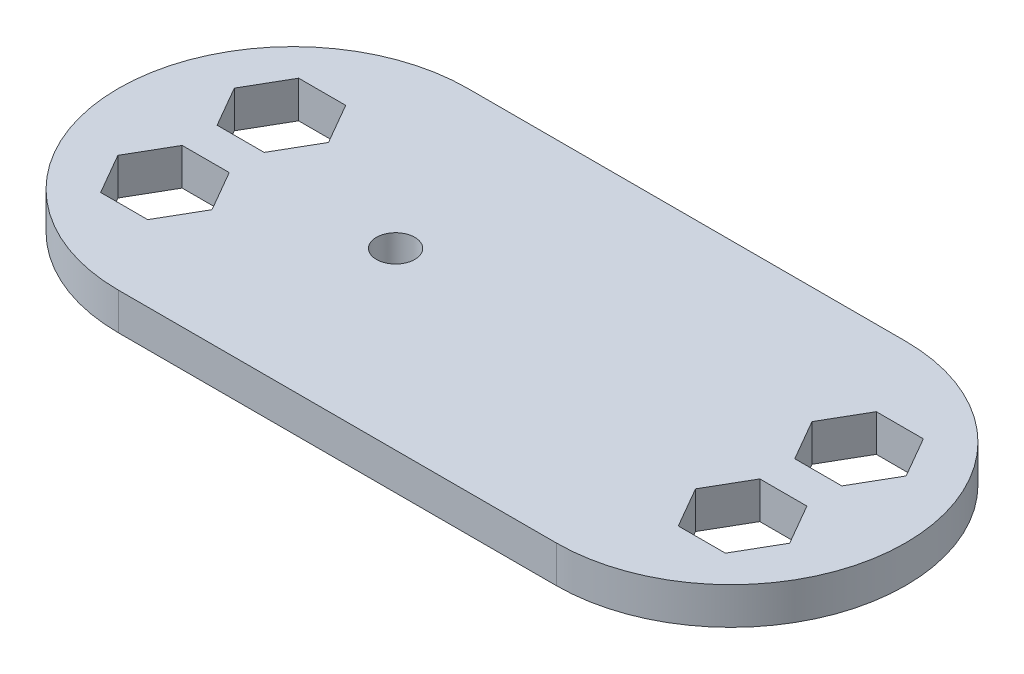
ISO-10303-21;
HEADER;
FILE_DESCRIPTION(('STEP AP214'),'2;1');
FILE_NAME('part.step','',(''),(''),'','','');
FILE_SCHEMA(('AUTOMOTIVE_DESIGN { 1 0 10303 214 1 1 1 1 }'));
ENDSEC;
DATA;
#1=APPLICATION_CONTEXT('core data for automotive mechanical design processes');
#2=APPLICATION_PROTOCOL_DEFINITION('international standard','automotive_design',2000,#1);
#3=PRODUCT_CONTEXT('',#1,'mechanical');
#4=PRODUCT('Part','Part','',(#3));
#5=PRODUCT_RELATED_PRODUCT_CATEGORY('part','',(#4));
#6=PRODUCT_DEFINITION_FORMATION('','',#4);
#7=PRODUCT_DEFINITION_CONTEXT('part definition',#1,'design');
#8=PRODUCT_DEFINITION('design','',#6,#7);
#9=PRODUCT_DEFINITION_SHAPE('','',#8);
#10=(LENGTH_UNIT() NAMED_UNIT(*) SI_UNIT(.MILLI.,.METRE.));
#11=(NAMED_UNIT(*) PLANE_ANGLE_UNIT() SI_UNIT($,.RADIAN.));
#12=(NAMED_UNIT(*) SI_UNIT($,.STERADIAN.) SOLID_ANGLE_UNIT());
#13=UNCERTAINTY_MEASURE_WITH_UNIT(LENGTH_MEASURE(1.E-05),#10,'distance_accuracy_value','');
#14=(GEOMETRIC_REPRESENTATION_CONTEXT(3) GLOBAL_UNCERTAINTY_ASSIGNED_CONTEXT((#13)) GLOBAL_UNIT_ASSIGNED_CONTEXT((#10,
#11,#12)) REPRESENTATION_CONTEXT('',''));
#15=CARTESIAN_POINT('',(0.,0.,0.));
#16=DIRECTION('',(0.,0.,1.));
#17=DIRECTION('',(1.,0.,0.));
#18=AXIS2_PLACEMENT_3D('',#15,#16,#17);
#19=CARTESIAN_POINT('',(-145.521414694939,3.175,14.0029406067574));
#20=DIRECTION('',(0.,1.,0.));
#21=DIRECTION('',(0.,0.,1.));
#22=AXIS2_PLACEMENT_3D('',#19,#20,#21);
#23=PLANE('',#22);
#24=CARTESIAN_POINT('',(-136.722782871318,3.175,13.9981314391168));
#25=DIRECTION('',(0.,1.,0.));
#26=DIRECTION('',(0.,0.,1.));
#27=AXIS2_PLACEMENT_3D('',#24,#25,#26);
#28=CIRCLE('',#27,1.65000000000002);
#29=CARTESIAN_POINT('',(-136.722782871318,3.175,15.6481314391168));
#30=VERTEX_POINT('',#29);
#31=EDGE_CURVE('E251',#30,#30,#28,.F.);
#32=ORIENTED_EDGE('',*,*,#31,.T.);
#33=EDGE_LOOP('',(#32));
#34=FACE_BOUND('',#33,.T.);
#35=CARTESIAN_POINT('',(-145.521414694939,3.175,14.0029406067574));
#36=DIRECTION('',(0.,1.,0.));
#37=DIRECTION('',(0.,0.,1.));
#38=AXIS2_PLACEMENT_3D('',#35,#36,#37);
#39=CIRCLE('',#38,15.);
#40=CARTESIAN_POINT('',(-145.521414694939,3.175,-0.997059393242624));
#41=VERTEX_POINT('',#40);
#42=CARTESIAN_POINT('',(-145.521414694939,3.175,29.0029406067574));
#43=VERTEX_POINT('',#42);
#44=EDGE_CURVE('E406',#41,#43,#39,.T.);
#45=ORIENTED_EDGE('',*,*,#44,.T.);
#46=DIRECTION('',(1.,0.,0.));
#47=VECTOR('',#46,1.);
#48=CARTESIAN_POINT('',(-145.521414694939,3.175,29.0029406067574));
#49=LINE('',#48,#47);
#50=CARTESIAN_POINT('',(-107.921414694939,3.175,29.0029406067574));
#51=VERTEX_POINT('',#50);
#52=EDGE_CURVE('E409',#43,#51,#49,.T.);
#53=ORIENTED_EDGE('',*,*,#52,.T.);
#54=CARTESIAN_POINT('',(-107.921414694939,3.175,14.0029406067574));
#55=DIRECTION('',(0.,1.,0.));
#56=DIRECTION('',(0.,0.,1.));
#57=AXIS2_PLACEMENT_3D('',#54,#55,#56);
#58=CIRCLE('',#57,15.);
#59=CARTESIAN_POINT('',(-107.921414694939,3.175,-0.997059393242629));
#60=VERTEX_POINT('',#59);
#61=EDGE_CURVE('E412',#51,#60,#58,.T.);
#62=ORIENTED_EDGE('',*,*,#61,.T.);
#63=DIRECTION('',(-1.,0.,0.));
#64=VECTOR('',#63,1.);
#65=CARTESIAN_POINT('',(-145.521414694939,3.175,-0.997059393242624));
#66=LINE('',#65,#64);
#67=EDGE_CURVE('E414',#60,#41,#66,.T.);
#68=ORIENTED_EDGE('',*,*,#67,.T.);
#69=EDGE_LOOP('',(#45,#53,#62,#68));
#70=FACE_BOUND('',#69,.T.);
#71=DIRECTION('',(0.500000000000001,0.,0.866025403784438));
#72=VECTOR('',#71,1.);
#73=CARTESIAN_POINT('',(-153.542140637102,3.175,22.5029406067573));
#74=LINE('',#73,#72);
#75=CARTESIAN_POINT('',(-155.562866579266,3.175,19.0029406067574));
#76=VERTEX_POINT('',#75);
#77=CARTESIAN_POINT('',(-153.542140637102,3.175,22.5029406067573));
#78=VERTEX_POINT('',#77);
#79=EDGE_CURVE('E363',#76,#78,#74,.T.);
#80=ORIENTED_EDGE('',*,*,#79,.F.);
#81=DIRECTION('',(-0.499999999999998,0.,0.86602540378444));
#82=VECTOR('',#81,1.);
#83=CARTESIAN_POINT('',(-155.562866579266,3.175,19.0029406067574));
#84=LINE('',#83,#82);
#85=CARTESIAN_POINT('',(-153.542140637102,3.175,15.5029406067574));
#86=VERTEX_POINT('',#85);
#87=EDGE_CURVE('E361',#86,#76,#84,.T.);
#88=ORIENTED_EDGE('',*,*,#87,.F.);
#89=DIRECTION('',(-1.,0.,0.));
#90=VECTOR('',#89,1.);
#91=CARTESIAN_POINT('',(-153.542140637102,3.175,15.5029406067574));
#92=LINE('',#91,#90);
#93=CARTESIAN_POINT('',(-149.500688752775,3.175,15.5029406067574));
#94=VERTEX_POINT('',#93);
#95=EDGE_CURVE('E373',#94,#86,#92,.T.);
#96=ORIENTED_EDGE('',*,*,#95,.F.);
#97=DIRECTION('',(-0.500000000000002,0.,-0.866025403784437));
#98=VECTOR('',#97,1.);
#99=CARTESIAN_POINT('',(-149.500688752775,3.175,15.5029406067574));
#100=LINE('',#99,#98);
#101=CARTESIAN_POINT('',(-147.479962810611,3.175,19.0029406067574));
#102=VERTEX_POINT('',#101);
#103=EDGE_CURVE('E370',#102,#94,#100,.T.);
#104=ORIENTED_EDGE('',*,*,#103,.F.);
#105=DIRECTION('',(0.500000000000002,0.,-0.866025403784438));
#106=VECTOR('',#105,1.);
#107=CARTESIAN_POINT('',(-147.479962810611,3.175,19.0029406067574));
#108=LINE('',#107,#106);
#109=CARTESIAN_POINT('',(-149.500688752775,3.175,22.5029406067573));
#110=VERTEX_POINT('',#109);
#111=EDGE_CURVE('E368',#110,#102,#108,.T.);
#112=ORIENTED_EDGE('',*,*,#111,.F.);
#113=DIRECTION('',(1.,0.,0.));
#114=VECTOR('',#113,1.);
#115=CARTESIAN_POINT('',(-149.500688752775,3.175,22.5029406067573));
#116=LINE('',#115,#114);
#117=EDGE_CURVE('E366',#78,#110,#116,.T.);
#118=ORIENTED_EDGE('',*,*,#117,.F.);
#119=EDGE_LOOP('',(#80,#88,#96,#104,#112,#118));
#120=FACE_BOUND('',#119,.T.);
#121=DIRECTION('',(0.500000000000002,0.,-0.866025403784437));
#122=VECTOR('',#121,1.);
#123=CARTESIAN_POINT('',(-149.500688752775,3.175,12.5029406067574));
#124=LINE('',#123,#122);
#125=CARTESIAN_POINT('',(-149.500688752775,3.175,12.5029406067574));
#126=VERTEX_POINT('',#125);
#127=CARTESIAN_POINT('',(-147.479962810611,3.175,9.00294060675737));
#128=VERTEX_POINT('',#127);
#129=EDGE_CURVE('E318',#126,#128,#124,.T.);
#130=ORIENTED_EDGE('',*,*,#129,.F.);
#131=DIRECTION('',(1.,0.,0.));
#132=VECTOR('',#131,1.);
#133=CARTESIAN_POINT('',(-153.542140637102,3.175,12.5029406067574));
#134=LINE('',#133,#132);
#135=CARTESIAN_POINT('',(-153.542140637102,3.175,12.5029406067574));
#136=VERTEX_POINT('',#135);
#137=EDGE_CURVE('E316',#136,#126,#134,.T.);
#138=ORIENTED_EDGE('',*,*,#137,.F.);
#139=DIRECTION('',(0.499999999999998,0.,0.86602540378444));
#140=VECTOR('',#139,1.);
#141=CARTESIAN_POINT('',(-155.562866579266,3.175,9.00294060675738));
#142=LINE('',#141,#140);
#143=CARTESIAN_POINT('',(-155.562866579266,3.175,9.00294060675738));
#144=VERTEX_POINT('',#143);
#145=EDGE_CURVE('E328',#144,#136,#142,.T.);
#146=ORIENTED_EDGE('',*,*,#145,.F.);
#147=DIRECTION('',(-0.500000000000001,0.,0.866025403784438));
#148=VECTOR('',#147,1.);
#149=CARTESIAN_POINT('',(-153.542140637102,3.175,5.50294060675741));
#150=LINE('',#149,#148);
#151=CARTESIAN_POINT('',(-153.542140637102,3.175,5.50294060675741));
#152=VERTEX_POINT('',#151);
#153=EDGE_CURVE('E325',#152,#144,#150,.T.);
#154=ORIENTED_EDGE('',*,*,#153,.F.);
#155=DIRECTION('',(-1.,0.,0.));
#156=VECTOR('',#155,1.);
#157=CARTESIAN_POINT('',(-149.500688752775,3.175,5.50294060675741));
#158=LINE('',#157,#156);
#159=CARTESIAN_POINT('',(-149.500688752775,3.175,5.50294060675741));
#160=VERTEX_POINT('',#159);
#161=EDGE_CURVE('E323',#160,#152,#158,.T.);
#162=ORIENTED_EDGE('',*,*,#161,.F.);
#163=DIRECTION('',(-0.500000000000002,0.,-0.866025403784438));
#164=VECTOR('',#163,1.);
#165=CARTESIAN_POINT('',(-147.479962810611,3.175,9.00294060675737));
#166=LINE('',#165,#164);
#167=EDGE_CURVE('E321',#128,#160,#166,.T.);
#168=ORIENTED_EDGE('',*,*,#167,.F.);
#169=EDGE_LOOP('',(#130,#138,#146,#154,#162,#168));
#170=FACE_BOUND('',#169,.T.);
#171=DIRECTION('',(-0.500000000000002,0.,0.866025403784437));
#172=VECTOR('',#171,1.);
#173=CARTESIAN_POINT('',(-103.942140637102,3.175,15.5029406067574));
#174=LINE('',#173,#172);
#175=CARTESIAN_POINT('',(-103.942140637102,3.175,15.5029406067574));
#176=VERTEX_POINT('',#175);
#177=CARTESIAN_POINT('',(-105.962866579266,3.175,19.0029406067574));
#178=VERTEX_POINT('',#177);
#179=EDGE_CURVE('E273',#176,#178,#174,.T.);
#180=ORIENTED_EDGE('',*,*,#179,.F.);
#181=DIRECTION('',(-1.,0.,0.));
#182=VECTOR('',#181,1.);
#183=CARTESIAN_POINT('',(-99.900688752775,3.175,15.5029406067574));
#184=LINE('',#183,#182);
#185=CARTESIAN_POINT('',(-99.900688752775,3.175,15.5029406067574));
#186=VERTEX_POINT('',#185);
#187=EDGE_CURVE('E271',#186,#176,#184,.T.);
#188=ORIENTED_EDGE('',*,*,#187,.F.);
#189=DIRECTION('',(-0.499999999999998,0.,-0.86602540378444));
#190=VECTOR('',#189,1.);
#191=CARTESIAN_POINT('',(-97.8799628106113,3.175,19.0029406067574));
#192=LINE('',#191,#190);
#193=CARTESIAN_POINT('',(-97.8799628106113,3.175,19.0029406067574));
#194=VERTEX_POINT('',#193);
#195=EDGE_CURVE('E283',#194,#186,#192,.T.);
#196=ORIENTED_EDGE('',*,*,#195,.F.);
#197=DIRECTION('',(0.500000000000001,0.,-0.866025403784438));
#198=VECTOR('',#197,1.);
#199=CARTESIAN_POINT('',(-99.900688752775,3.175,22.5029406067574));
#200=LINE('',#199,#198);
#201=CARTESIAN_POINT('',(-99.900688752775,3.175,22.5029406067574));
#202=VERTEX_POINT('',#201);
#203=EDGE_CURVE('E280',#202,#194,#200,.T.);
#204=ORIENTED_EDGE('',*,*,#203,.F.);
#205=DIRECTION('',(1.,0.,0.));
#206=VECTOR('',#205,1.);
#207=CARTESIAN_POINT('',(-103.942140637102,3.175,22.5029406067574));
#208=LINE('',#207,#206);
#209=CARTESIAN_POINT('',(-103.942140637102,3.175,22.5029406067574));
#210=VERTEX_POINT('',#209);
#211=EDGE_CURVE('E278',#210,#202,#208,.T.);
#212=ORIENTED_EDGE('',*,*,#211,.F.);
#213=DIRECTION('',(0.500000000000002,0.,0.866025403784438));
#214=VECTOR('',#213,1.);
#215=CARTESIAN_POINT('',(-105.962866579266,3.175,19.0029406067574));
#216=LINE('',#215,#214);
#217=EDGE_CURVE('E276',#178,#210,#216,.T.);
#218=ORIENTED_EDGE('',*,*,#217,.F.);
#219=EDGE_LOOP('',(#180,#188,#196,#204,#212,#218));
#220=FACE_BOUND('',#219,.T.);
#221=DIRECTION('',(-0.500000000000001,0.,-0.866025403784438));
#222=VECTOR('',#221,1.);
#223=CARTESIAN_POINT('',(-99.900688752775,3.175,5.5029406067574));
#224=LINE('',#223,#222);
#225=CARTESIAN_POINT('',(-97.8799628106113,3.175,9.00294060675738));
#226=VERTEX_POINT('',#225);
#227=CARTESIAN_POINT('',(-99.900688752775,3.175,5.5029406067574));
#228=VERTEX_POINT('',#227);
#229=EDGE_CURVE('E226',#226,#228,#224,.T.);
#230=ORIENTED_EDGE('',*,*,#229,.F.);
#231=DIRECTION('',(0.499999999999998,0.,-0.86602540378444));
#232=VECTOR('',#231,1.);
#233=CARTESIAN_POINT('',(-97.8799628106113,3.175,9.00294060675738));
#234=LINE('',#233,#232);
#235=CARTESIAN_POINT('',(-99.900688752775,3.175,12.5029406067574));
#236=VERTEX_POINT('',#235);
#237=EDGE_CURVE('E218',#236,#226,#234,.T.);
#238=ORIENTED_EDGE('',*,*,#237,.F.);
#239=DIRECTION('',(1.,0.,0.));
#240=VECTOR('',#239,1.);
#241=CARTESIAN_POINT('',(-99.900688752775,3.175,12.5029406067574));
#242=LINE('',#241,#240);
#243=CARTESIAN_POINT('',(-103.942140637102,3.175,12.5029406067574));
#244=VERTEX_POINT('',#243);
#245=EDGE_CURVE('E248',#244,#236,#242,.T.);
#246=ORIENTED_EDGE('',*,*,#245,.F.);
#247=DIRECTION('',(0.500000000000002,0.,0.866025403784437));
#248=VECTOR('',#247,1.);
#249=CARTESIAN_POINT('',(-103.942140637102,3.175,12.5029406067574));
#250=LINE('',#249,#248);
#251=CARTESIAN_POINT('',(-105.962866579266,3.175,9.00294060675737));
#252=VERTEX_POINT('',#251);
#253=EDGE_CURVE('E246',#252,#244,#250,.T.);
#254=ORIENTED_EDGE('',*,*,#253,.F.);
#255=DIRECTION('',(-0.500000000000002,0.,0.866025403784438));
#256=VECTOR('',#255,1.);
#257=CARTESIAN_POINT('',(-105.962866579266,3.175,9.00294060675737));
#258=LINE('',#257,#256);
#259=CARTESIAN_POINT('',(-103.942140637102,3.175,5.5029406067574));
#260=VERTEX_POINT('',#259);
#261=EDGE_CURVE('E241',#260,#252,#258,.T.);
#262=ORIENTED_EDGE('',*,*,#261,.F.);
#263=DIRECTION('',(-1.,0.,0.));
#264=VECTOR('',#263,1.);
#265=CARTESIAN_POINT('',(-103.942140637102,3.175,5.5029406067574));
#266=LINE('',#265,#264);
#267=EDGE_CURVE('E239',#228,#260,#266,.T.);
#268=ORIENTED_EDGE('',*,*,#267,.F.);
#269=EDGE_LOOP('',(#230,#238,#246,#254,#262,#268));
#270=FACE_BOUND('',#269,.T.);
#271=ADVANCED_FACE('F33',(#34,#70,#120,#170,#220,#270),#23,.T.);
#272=CARTESIAN_POINT('',(-145.521414694939,0.,14.0029406067574));
#273=DIRECTION('',(0.,1.,0.));
#274=DIRECTION('',(0.,0.,1.));
#275=AXIS2_PLACEMENT_3D('',#272,#273,#274);
#276=PLANE('',#275);
#277=CARTESIAN_POINT('',(-136.722782871318,0.,13.9981314391168));
#278=DIRECTION('',(0.,-1.,0.));
#279=DIRECTION('',(0.,0.,-1.));
#280=AXIS2_PLACEMENT_3D('',#277,#278,#279);
#281=CIRCLE('',#280,1.65000000000002);
#282=CARTESIAN_POINT('',(-136.722782871318,0.,12.3481314391168));
#283=VERTEX_POINT('',#282);
#284=EDGE_CURVE('E592',#283,#283,#281,.T.);
#285=ORIENTED_EDGE('',*,*,#284,.F.);
#286=EDGE_LOOP('',(#285));
#287=FACE_BOUND('',#286,.T.);
#288=DIRECTION('',(-1.,0.,0.));
#289=VECTOR('',#288,1.);
#290=CARTESIAN_POINT('',(-99.900688752775,0.,15.5029406067574));
#291=LINE('',#290,#289);
#292=CARTESIAN_POINT('',(-99.900688752775,0.,15.5029406067574));
#293=VERTEX_POINT('',#292);
#294=CARTESIAN_POINT('',(-103.942140637102,0.,15.5029406067574));
#295=VERTEX_POINT('',#294);
#296=EDGE_CURVE('E234',#293,#295,#291,.T.);
#297=ORIENTED_EDGE('',*,*,#296,.T.);
#298=DIRECTION('',(-0.500000000000002,0.,0.866025403784437));
#299=VECTOR('',#298,1.);
#300=CARTESIAN_POINT('',(-103.942140637102,0.,15.5029406067574));
#301=LINE('',#300,#299);
#302=CARTESIAN_POINT('',(-105.962866579266,0.,19.0029406067574));
#303=VERTEX_POINT('',#302);
#304=EDGE_CURVE('E288',#295,#303,#301,.T.);
#305=ORIENTED_EDGE('',*,*,#304,.T.);
#306=DIRECTION('',(0.500000000000002,0.,0.866025403784438));
#307=VECTOR('',#306,1.);
#308=CARTESIAN_POINT('',(-105.962866579266,0.,19.0029406067574));
#309=LINE('',#308,#307);
#310=CARTESIAN_POINT('',(-103.942140637102,0.,22.5029406067574));
#311=VERTEX_POINT('',#310);
#312=EDGE_CURVE('E291',#303,#311,#309,.T.);
#313=ORIENTED_EDGE('',*,*,#312,.T.);
#314=DIRECTION('',(1.,0.,0.));
#315=VECTOR('',#314,1.);
#316=CARTESIAN_POINT('',(-103.942140637102,0.,22.5029406067574));
#317=LINE('',#316,#315);
#318=CARTESIAN_POINT('',(-99.900688752775,0.,22.5029406067574));
#319=VERTEX_POINT('',#318);
#320=EDGE_CURVE('E294',#311,#319,#317,.T.);
#321=ORIENTED_EDGE('',*,*,#320,.T.);
#322=DIRECTION('',(0.500000000000001,0.,-0.866025403784438));
#323=VECTOR('',#322,1.);
#324=CARTESIAN_POINT('',(-99.900688752775,0.,22.5029406067574));
#325=LINE('',#324,#323);
#326=CARTESIAN_POINT('',(-97.8799628106113,0.,19.0029406067574));
#327=VERTEX_POINT('',#326);
#328=EDGE_CURVE('E297',#319,#327,#325,.T.);
#329=ORIENTED_EDGE('',*,*,#328,.T.);
#330=DIRECTION('',(-0.499999999999998,0.,-0.86602540378444));
#331=VECTOR('',#330,1.);
#332=CARTESIAN_POINT('',(-97.8799628106113,0.,19.0029406067574));
#333=LINE('',#332,#331);
#334=EDGE_CURVE('E274',#327,#293,#333,.T.);
#335=ORIENTED_EDGE('',*,*,#334,.T.);
#336=EDGE_LOOP('',(#297,#305,#313,#321,#329,#335));
#337=FACE_BOUND('',#336,.T.);
#338=DIRECTION('',(-0.499999999999998,0.,0.86602540378444));
#339=VECTOR('',#338,1.);
#340=CARTESIAN_POINT('',(-155.562866579266,0.,19.0029406067574));
#341=LINE('',#340,#339);
#342=CARTESIAN_POINT('',(-153.542140637102,0.,15.5029406067574));
#343=VERTEX_POINT('',#342);
#344=CARTESIAN_POINT('',(-155.562866579266,0.,19.0029406067574));
#345=VERTEX_POINT('',#344);
#346=EDGE_CURVE('E360',#343,#345,#341,.T.);
#347=ORIENTED_EDGE('',*,*,#346,.T.);
#348=DIRECTION('',(0.500000000000001,0.,0.866025403784438));
#349=VECTOR('',#348,1.);
#350=CARTESIAN_POINT('',(-153.542140637102,0.,22.5029406067573));
#351=LINE('',#350,#349);
#352=CARTESIAN_POINT('',(-153.542140637102,0.,22.5029406067573));
#353=VERTEX_POINT('',#352);
#354=EDGE_CURVE('E378',#345,#353,#351,.T.);
#355=ORIENTED_EDGE('',*,*,#354,.T.);
#356=DIRECTION('',(1.,0.,0.));
#357=VECTOR('',#356,1.);
#358=CARTESIAN_POINT('',(-149.500688752775,0.,22.5029406067573));
#359=LINE('',#358,#357);
#360=CARTESIAN_POINT('',(-149.500688752775,0.,22.5029406067573));
#361=VERTEX_POINT('',#360);
#362=EDGE_CURVE('E381',#353,#361,#359,.T.);
#363=ORIENTED_EDGE('',*,*,#362,.T.);
#364=DIRECTION('',(0.500000000000002,0.,-0.866025403784438));
#365=VECTOR('',#364,1.);
#366=CARTESIAN_POINT('',(-147.479962810611,0.,19.0029406067574));
#367=LINE('',#366,#365);
#368=CARTESIAN_POINT('',(-147.479962810611,0.,19.0029406067574));
#369=VERTEX_POINT('',#368);
#370=EDGE_CURVE('E384',#361,#369,#367,.T.);
#371=ORIENTED_EDGE('',*,*,#370,.T.);
#372=DIRECTION('',(-0.500000000000002,0.,-0.866025403784437));
#373=VECTOR('',#372,1.);
#374=CARTESIAN_POINT('',(-149.500688752775,0.,15.5029406067574));
#375=LINE('',#374,#373);
#376=CARTESIAN_POINT('',(-149.500688752775,0.,15.5029406067574));
#377=VERTEX_POINT('',#376);
#378=EDGE_CURVE('E387',#369,#377,#375,.T.);
#379=ORIENTED_EDGE('',*,*,#378,.T.);
#380=DIRECTION('',(-1.,0.,0.));
#381=VECTOR('',#380,1.);
#382=CARTESIAN_POINT('',(-153.542140637102,0.,15.5029406067574));
#383=LINE('',#382,#381);
#384=EDGE_CURVE('E364',#377,#343,#383,.T.);
#385=ORIENTED_EDGE('',*,*,#384,.T.);
#386=EDGE_LOOP('',(#347,#355,#363,#371,#379,#385));
#387=FACE_BOUND('',#386,.T.);
#388=CARTESIAN_POINT('',(-145.521414694939,0.,14.0029406067574));
#389=DIRECTION('',(0.,1.,0.));
#390=DIRECTION('',(0.,0.,1.));
#391=AXIS2_PLACEMENT_3D('',#388,#389,#390);
#392=CIRCLE('',#391,15.);
#393=CARTESIAN_POINT('',(-145.521414694939,0.,-0.997059393242624));
#394=VERTEX_POINT('',#393);
#395=CARTESIAN_POINT('',(-145.521414694939,0.,29.0029406067574));
#396=VERTEX_POINT('',#395);
#397=EDGE_CURVE('E405',#394,#396,#392,.T.);
#398=ORIENTED_EDGE('',*,*,#397,.F.);
#399=DIRECTION('',(-1.,0.,0.));
#400=VECTOR('',#399,1.);
#401=CARTESIAN_POINT('',(-145.521414694939,0.,-0.997059393242624));
#402=LINE('',#401,#400);
#403=CARTESIAN_POINT('',(-107.921414694939,0.,-0.997059393242629));
#404=VERTEX_POINT('',#403);
#405=EDGE_CURVE('E410',#404,#394,#402,.T.);
#406=ORIENTED_EDGE('',*,*,#405,.F.);
#407=CARTESIAN_POINT('',(-107.921414694939,0.,14.0029406067574));
#408=DIRECTION('',(0.,1.,0.));
#409=DIRECTION('',(0.,0.,1.));
#410=AXIS2_PLACEMENT_3D('',#407,#408,#409);
#411=CIRCLE('',#410,15.);
#412=CARTESIAN_POINT('',(-107.921414694939,0.,29.0029406067574));
#413=VERTEX_POINT('',#412);
#414=EDGE_CURVE('E421',#413,#404,#411,.T.);
#415=ORIENTED_EDGE('',*,*,#414,.F.);
#416=DIRECTION('',(1.,0.,0.));
#417=VECTOR('',#416,1.);
#418=CARTESIAN_POINT('',(-145.521414694939,0.,29.0029406067574));
#419=LINE('',#418,#417);
#420=EDGE_CURVE('E419',#396,#413,#419,.T.);
#421=ORIENTED_EDGE('',*,*,#420,.F.);
#422=EDGE_LOOP('',(#398,#406,#415,#421));
#423=FACE_BOUND('',#422,.T.);
#424=DIRECTION('',(1.,0.,0.));
#425=VECTOR('',#424,1.);
#426=CARTESIAN_POINT('',(-153.542140637102,0.,12.5029406067574));
#427=LINE('',#426,#425);
#428=CARTESIAN_POINT('',(-153.542140637102,0.,12.5029406067574));
#429=VERTEX_POINT('',#428);
#430=CARTESIAN_POINT('',(-149.500688752775,0.,12.5029406067574));
#431=VERTEX_POINT('',#430);
#432=EDGE_CURVE('E315',#429,#431,#427,.T.);
#433=ORIENTED_EDGE('',*,*,#432,.T.);
#434=DIRECTION('',(0.500000000000002,0.,-0.866025403784437));
#435=VECTOR('',#434,1.);
#436=CARTESIAN_POINT('',(-149.500688752775,0.,12.5029406067574));
#437=LINE('',#436,#435);
#438=CARTESIAN_POINT('',(-147.479962810611,0.,9.00294060675737));
#439=VERTEX_POINT('',#438);
#440=EDGE_CURVE('E333',#431,#439,#437,.T.);
#441=ORIENTED_EDGE('',*,*,#440,.T.);
#442=DIRECTION('',(-0.500000000000002,0.,-0.866025403784438));
#443=VECTOR('',#442,1.);
#444=CARTESIAN_POINT('',(-147.479962810611,0.,9.00294060675737));
#445=LINE('',#444,#443);
#446=CARTESIAN_POINT('',(-149.500688752775,0.,5.50294060675741));
#447=VERTEX_POINT('',#446);
#448=EDGE_CURVE('E336',#439,#447,#445,.T.);
#449=ORIENTED_EDGE('',*,*,#448,.T.);
#450=DIRECTION('',(-1.,0.,0.));
#451=VECTOR('',#450,1.);
#452=CARTESIAN_POINT('',(-149.500688752775,0.,5.50294060675741));
#453=LINE('',#452,#451);
#454=CARTESIAN_POINT('',(-153.542140637102,0.,5.50294060675741));
#455=VERTEX_POINT('',#454);
#456=EDGE_CURVE('E339',#447,#455,#453,.T.);
#457=ORIENTED_EDGE('',*,*,#456,.T.);
#458=DIRECTION('',(-0.500000000000001,0.,0.866025403784438));
#459=VECTOR('',#458,1.);
#460=CARTESIAN_POINT('',(-153.542140637102,0.,5.50294060675741));
#461=LINE('',#460,#459);
#462=CARTESIAN_POINT('',(-155.562866579266,0.,9.00294060675738));
#463=VERTEX_POINT('',#462);
#464=EDGE_CURVE('E342',#455,#463,#461,.T.);
#465=ORIENTED_EDGE('',*,*,#464,.T.);
#466=DIRECTION('',(0.499999999999998,0.,0.86602540378444));
#467=VECTOR('',#466,1.);
#468=CARTESIAN_POINT('',(-155.562866579266,0.,9.00294060675738));
#469=LINE('',#468,#467);
#470=EDGE_CURVE('E319',#463,#429,#469,.T.);
#471=ORIENTED_EDGE('',*,*,#470,.T.);
#472=EDGE_LOOP('',(#433,#441,#449,#457,#465,#471));
#473=FACE_BOUND('',#472,.T.);
#474=DIRECTION('',(0.499999999999998,0.,-0.86602540378444));
#475=VECTOR('',#474,1.);
#476=CARTESIAN_POINT('',(-97.8799628106113,0.,9.00294060675738));
#477=LINE('',#476,#475);
#478=CARTESIAN_POINT('',(-99.900688752775,0.,12.5029406067574));
#479=VERTEX_POINT('',#478);
#480=CARTESIAN_POINT('',(-97.8799628106113,0.,9.00294060675738));
#481=VERTEX_POINT('',#480);
#482=EDGE_CURVE('E56',#479,#481,#477,.T.);
#483=ORIENTED_EDGE('',*,*,#482,.T.);
#484=DIRECTION('',(-0.500000000000001,0.,-0.866025403784438));
#485=VECTOR('',#484,1.);
#486=CARTESIAN_POINT('',(-99.900688752775,0.,5.5029406067574));
#487=LINE('',#486,#485);
#488=CARTESIAN_POINT('',(-99.900688752775,0.,5.5029406067574));
#489=VERTEX_POINT('',#488);
#490=EDGE_CURVE('E233',#481,#489,#487,.T.);
#491=ORIENTED_EDGE('',*,*,#490,.T.);
#492=DIRECTION('',(-1.,0.,0.));
#493=VECTOR('',#492,1.);
#494=CARTESIAN_POINT('',(-103.942140637102,0.,5.5029406067574));
#495=LINE('',#494,#493);
#496=CARTESIAN_POINT('',(-103.942140637102,0.,5.5029406067574));
#497=VERTEX_POINT('',#496);
#498=EDGE_CURVE('E253',#489,#497,#495,.T.);
#499=ORIENTED_EDGE('',*,*,#498,.T.);
#500=DIRECTION('',(-0.500000000000002,0.,0.866025403784438));
#501=VECTOR('',#500,1.);
#502=CARTESIAN_POINT('',(-105.962866579266,0.,9.00294060675737));
#503=LINE('',#502,#501);
#504=CARTESIAN_POINT('',(-105.962866579266,0.,9.00294060675737));
#505=VERTEX_POINT('',#504);
#506=EDGE_CURVE('E256',#497,#505,#503,.T.);
#507=ORIENTED_EDGE('',*,*,#506,.T.);
#508=DIRECTION('',(0.500000000000002,0.,0.866025403784437));
#509=VECTOR('',#508,1.);
#510=CARTESIAN_POINT('',(-103.942140637102,0.,12.5029406067574));
#511=LINE('',#510,#509);
#512=CARTESIAN_POINT('',(-103.942140637102,0.,12.5029406067574));
#513=VERTEX_POINT('',#512);
#514=EDGE_CURVE('E259',#505,#513,#511,.T.);
#515=ORIENTED_EDGE('',*,*,#514,.T.);
#516=DIRECTION('',(1.,0.,0.));
#517=VECTOR('',#516,1.);
#518=CARTESIAN_POINT('',(-99.900688752775,0.,12.5029406067574));
#519=LINE('',#518,#517);
#520=EDGE_CURVE('E227',#513,#479,#519,.T.);
#521=ORIENTED_EDGE('',*,*,#520,.T.);
#522=EDGE_LOOP('',(#483,#491,#499,#507,#515,#521));
#523=FACE_BOUND('',#522,.T.);
#524=ADVANCED_FACE('F439',(#287,#337,#387,#423,#473,#523),#276,.F.);
#525=CARTESIAN_POINT('',(-145.521414694939,3.175,14.0029406067574));
#526=DIRECTION('',(0.,-1.,0.));
#527=DIRECTION('',(0.,0.,-1.));
#528=AXIS2_PLACEMENT_3D('',#525,#526,#527);
#529=CYLINDRICAL_SURFACE('',#528,15.);
#530=ORIENTED_EDGE('',*,*,#397,.T.);
#531=DIRECTION('',(0.,-1.,0.));
#532=VECTOR('',#531,1.);
#533=CARTESIAN_POINT('',(-145.521414694939,3.175,29.0029406067574));
#534=LINE('',#533,#532);
#535=EDGE_CURVE('E11',#43,#396,#534,.T.);
#536=ORIENTED_EDGE('',*,*,#535,.F.);
#537=ORIENTED_EDGE('',*,*,#44,.F.);
#538=DIRECTION('',(0.,-1.,0.));
#539=VECTOR('',#538,1.);
#540=CARTESIAN_POINT('',(-145.521414694939,3.175,-0.997059393242624));
#541=LINE('',#540,#539);
#542=EDGE_CURVE('E416',#41,#394,#541,.T.);
#543=ORIENTED_EDGE('',*,*,#542,.T.);
#544=EDGE_LOOP('',(#530,#536,#537,#543));
#545=FACE_BOUND('',#544,.T.);
#546=ADVANCED_FACE('F35',(#545),#529,.T.);
#547=CARTESIAN_POINT('',(-145.521414694939,3.175,29.0029406067574));
#548=DIRECTION('',(0.,0.,-1.));
#549=DIRECTION('',(-1.,0.,0.));
#550=AXIS2_PLACEMENT_3D('',#547,#548,#549);
#551=PLANE('',#550);
#552=ORIENTED_EDGE('',*,*,#420,.T.);
#553=DIRECTION('',(0.,-1.,0.));
#554=VECTOR('',#553,1.);
#555=CARTESIAN_POINT('',(-107.921414694939,3.175,29.0029406067574));
#556=LINE('',#555,#554);
#557=EDGE_CURVE('E41',#51,#413,#556,.T.);
#558=ORIENTED_EDGE('',*,*,#557,.F.);
#559=ORIENTED_EDGE('',*,*,#52,.F.);
#560=ORIENTED_EDGE('',*,*,#535,.T.);
#561=EDGE_LOOP('',(#552,#558,#559,#560));
#562=FACE_BOUND('',#561,.T.);
#563=ADVANCED_FACE('F450',(#562),#551,.F.);
#564=CARTESIAN_POINT('',(-107.921414694939,3.175,14.0029406067574));
#565=DIRECTION('',(0.,-1.,0.));
#566=DIRECTION('',(0.,0.,-1.));
#567=AXIS2_PLACEMENT_3D('',#564,#565,#566);
#568=CYLINDRICAL_SURFACE('',#567,15.);
#569=ORIENTED_EDGE('',*,*,#414,.T.);
#570=DIRECTION('',(0.,-1.,0.));
#571=VECTOR('',#570,1.);
#572=CARTESIAN_POINT('',(-107.921414694939,3.175,-0.997059393242629));
#573=LINE('',#572,#571);
#574=EDGE_CURVE('E426',#60,#404,#573,.T.);
#575=ORIENTED_EDGE('',*,*,#574,.F.);
#576=ORIENTED_EDGE('',*,*,#61,.F.);
#577=ORIENTED_EDGE('',*,*,#557,.T.);
#578=EDGE_LOOP('',(#569,#575,#576,#577));
#579=FACE_BOUND('',#578,.T.);
#580=ADVANCED_FACE('F433',(#579),#568,.T.);
#581=CARTESIAN_POINT('',(-145.521414694939,3.175,-0.997059393242624));
#582=DIRECTION('',(0.,0.,1.));
#583=DIRECTION('',(1.,0.,0.));
#584=AXIS2_PLACEMENT_3D('',#581,#582,#583);
#585=PLANE('',#584);
#586=ORIENTED_EDGE('',*,*,#405,.T.);
#587=ORIENTED_EDGE('',*,*,#542,.F.);
#588=ORIENTED_EDGE('',*,*,#67,.F.);
#589=ORIENTED_EDGE('',*,*,#574,.T.);
#590=EDGE_LOOP('',(#586,#587,#588,#589));
#591=FACE_BOUND('',#590,.T.);
#592=ADVANCED_FACE('F443',(#591),#585,.F.);
#593=CARTESIAN_POINT('',(-155.562866579266,3.175,19.0029406067574));
#594=DIRECTION('',(0.866025403784439,0.,0.499999999999998));
#595=DIRECTION('',(0.499999999999998,0.,-0.86602540378444));
#596=AXIS2_PLACEMENT_3D('',#593,#594,#595);
#597=PLANE('',#596);
#598=ORIENTED_EDGE('',*,*,#346,.F.);
#599=DIRECTION('',(0.,-1.,0.));
#600=VECTOR('',#599,1.);
#601=CARTESIAN_POINT('',(-153.542140637102,3.175,15.5029406067574));
#602=LINE('',#601,#600);
#603=EDGE_CURVE('E375',#86,#343,#602,.T.);
#604=ORIENTED_EDGE('',*,*,#603,.F.);
#605=ORIENTED_EDGE('',*,*,#87,.T.);
#606=DIRECTION('',(0.,-1.,0.));
#607=VECTOR('',#606,1.);
#608=CARTESIAN_POINT('',(-155.562866579266,3.175,19.0029406067574));
#609=LINE('',#608,#607);
#610=EDGE_CURVE('E402',#76,#345,#609,.T.);
#611=ORIENTED_EDGE('',*,*,#610,.T.);
#612=EDGE_LOOP('',(#598,#604,#605,#611));
#613=FACE_BOUND('',#612,.T.);
#614=ADVANCED_FACE('F468',(#613),#597,.T.);
#615=CARTESIAN_POINT('',(-153.542140637102,3.175,22.5029406067573));
#616=DIRECTION('',(0.866025403784438,0.,-0.500000000000001));
#617=DIRECTION('',(-0.500000000000001,0.,-0.866025403784438));
#618=AXIS2_PLACEMENT_3D('',#615,#616,#617);
#619=PLANE('',#618);
#620=ORIENTED_EDGE('',*,*,#354,.F.);
#621=ORIENTED_EDGE('',*,*,#610,.F.);
#622=ORIENTED_EDGE('',*,*,#79,.T.);
#623=DIRECTION('',(0.,-1.,0.));
#624=VECTOR('',#623,1.);
#625=CARTESIAN_POINT('',(-153.542140637102,3.175,22.5029406067573));
#626=LINE('',#625,#624);
#627=EDGE_CURVE('E400',#78,#353,#626,.T.);
#628=ORIENTED_EDGE('',*,*,#627,.T.);
#629=EDGE_LOOP('',(#620,#621,#622,#628));
#630=FACE_BOUND('',#629,.T.);
#631=ADVANCED_FACE('F475',(#630),#619,.T.);
#632=CARTESIAN_POINT('',(-149.500688752775,3.175,22.5029406067573));
#633=DIRECTION('',(0.,0.,-1.));
#634=DIRECTION('',(-1.,0.,0.));
#635=AXIS2_PLACEMENT_3D('',#632,#633,#634);
#636=PLANE('',#635);
#637=ORIENTED_EDGE('',*,*,#362,.F.);
#638=ORIENTED_EDGE('',*,*,#627,.F.);
#639=ORIENTED_EDGE('',*,*,#117,.T.);
#640=DIRECTION('',(0.,-1.,0.));
#641=VECTOR('',#640,1.);
#642=CARTESIAN_POINT('',(-149.500688752775,3.175,22.5029406067573));
#643=LINE('',#642,#641);
#644=EDGE_CURVE('E398',#110,#361,#643,.T.);
#645=ORIENTED_EDGE('',*,*,#644,.T.);
#646=EDGE_LOOP('',(#637,#638,#639,#645));
#647=FACE_BOUND('',#646,.T.);
#648=ADVANCED_FACE('F480',(#647),#636,.T.);
#649=CARTESIAN_POINT('',(-147.479962810611,3.175,19.0029406067574));
#650=DIRECTION('',(-0.866025403784438,0.,-0.500000000000002));
#651=DIRECTION('',(-0.500000000000002,0.,0.866025403784438));
#652=AXIS2_PLACEMENT_3D('',#649,#650,#651);
#653=PLANE('',#652);
#654=ORIENTED_EDGE('',*,*,#370,.F.);
#655=ORIENTED_EDGE('',*,*,#644,.F.);
#656=ORIENTED_EDGE('',*,*,#111,.T.);
#657=DIRECTION('',(0.,-1.,0.));
#658=VECTOR('',#657,1.);
#659=CARTESIAN_POINT('',(-147.479962810611,3.175,19.0029406067574));
#660=LINE('',#659,#658);
#661=EDGE_CURVE('E396',#102,#369,#660,.T.);
#662=ORIENTED_EDGE('',*,*,#661,.T.);
#663=EDGE_LOOP('',(#654,#655,#656,#662));
#664=FACE_BOUND('',#663,.T.);
#665=ADVANCED_FACE('F505',(#664),#653,.T.);
#666=CARTESIAN_POINT('',(-149.500688752775,3.175,15.5029406067574));
#667=DIRECTION('',(-0.866025403784437,0.,0.500000000000002));
#668=DIRECTION('',(0.500000000000002,0.,0.866025403784437));
#669=AXIS2_PLACEMENT_3D('',#666,#667,#668);
#670=PLANE('',#669);
#671=ORIENTED_EDGE('',*,*,#378,.F.);
#672=ORIENTED_EDGE('',*,*,#661,.F.);
#673=ORIENTED_EDGE('',*,*,#103,.T.);
#674=DIRECTION('',(0.,-1.,0.));
#675=VECTOR('',#674,1.);
#676=CARTESIAN_POINT('',(-149.500688752775,3.175,15.5029406067574));
#677=LINE('',#676,#675);
#678=EDGE_CURVE('E394',#94,#377,#677,.T.);
#679=ORIENTED_EDGE('',*,*,#678,.T.);
#680=EDGE_LOOP('',(#671,#672,#673,#679));
#681=FACE_BOUND('',#680,.T.);
#682=ADVANCED_FACE('F494',(#681),#670,.T.);
#683=CARTESIAN_POINT('',(-153.542140637102,3.175,15.5029406067574));
#684=DIRECTION('',(0.,0.,1.));
#685=DIRECTION('',(1.,0.,0.));
#686=AXIS2_PLACEMENT_3D('',#683,#684,#685);
#687=PLANE('',#686);
#688=ORIENTED_EDGE('',*,*,#384,.F.);
#689=ORIENTED_EDGE('',*,*,#678,.F.);
#690=ORIENTED_EDGE('',*,*,#95,.T.);
#691=ORIENTED_EDGE('',*,*,#603,.T.);
#692=EDGE_LOOP('',(#688,#689,#690,#691));
#693=FACE_BOUND('',#692,.T.);
#694=ADVANCED_FACE('F488',(#693),#687,.T.);
#695=CARTESIAN_POINT('',(-153.542140637102,3.175,12.5029406067574));
#696=DIRECTION('',(0.,0.,-1.));
#697=DIRECTION('',(-1.,0.,0.));
#698=AXIS2_PLACEMENT_3D('',#695,#696,#697);
#699=PLANE('',#698);
#700=ORIENTED_EDGE('',*,*,#432,.F.);
#701=DIRECTION('',(0.,-1.,0.));
#702=VECTOR('',#701,1.);
#703=CARTESIAN_POINT('',(-153.542140637102,3.175,12.5029406067574));
#704=LINE('',#703,#702);
#705=EDGE_CURVE('E330',#136,#429,#704,.T.);
#706=ORIENTED_EDGE('',*,*,#705,.F.);
#707=ORIENTED_EDGE('',*,*,#137,.T.);
#708=DIRECTION('',(0.,-1.,0.));
#709=VECTOR('',#708,1.);
#710=CARTESIAN_POINT('',(-149.500688752775,3.175,12.5029406067574));
#711=LINE('',#710,#709);
#712=EDGE_CURVE('E357',#126,#431,#711,.T.);
#713=ORIENTED_EDGE('',*,*,#712,.T.);
#714=EDGE_LOOP('',(#700,#706,#707,#713));
#715=FACE_BOUND('',#714,.T.);
#716=ADVANCED_FACE('F517',(#715),#699,.T.);
#717=CARTESIAN_POINT('',(-149.500688752775,3.175,12.5029406067574));
#718=DIRECTION('',(-0.866025403784437,0.,-0.500000000000002));
#719=DIRECTION('',(-0.500000000000002,0.,0.866025403784437));
#720=AXIS2_PLACEMENT_3D('',#717,#718,#719);
#721=PLANE('',#720);
#722=ORIENTED_EDGE('',*,*,#440,.F.);
#723=ORIENTED_EDGE('',*,*,#712,.F.);
#724=ORIENTED_EDGE('',*,*,#129,.T.);
#725=DIRECTION('',(0.,-1.,0.));
#726=VECTOR('',#725,1.);
#727=CARTESIAN_POINT('',(-147.479962810611,3.175,9.00294060675737));
#728=LINE('',#727,#726);
#729=EDGE_CURVE('E355',#128,#439,#728,.T.);
#730=ORIENTED_EDGE('',*,*,#729,.T.);
#731=EDGE_LOOP('',(#722,#723,#724,#730));
#732=FACE_BOUND('',#731,.T.);
#733=ADVANCED_FACE('F520',(#732),#721,.T.);
#734=CARTESIAN_POINT('',(-147.479962810611,3.175,9.00294060675737));
#735=DIRECTION('',(-0.866025403784437,0.,0.500000000000002));
#736=DIRECTION('',(0.500000000000002,0.,0.866025403784438));
#737=AXIS2_PLACEMENT_3D('',#734,#735,#736);
#738=PLANE('',#737);
#739=ORIENTED_EDGE('',*,*,#448,.F.);
#740=ORIENTED_EDGE('',*,*,#729,.F.);
#741=ORIENTED_EDGE('',*,*,#167,.T.);
#742=DIRECTION('',(0.,-1.,0.));
#743=VECTOR('',#742,1.);
#744=CARTESIAN_POINT('',(-149.500688752775,3.175,5.50294060675741));
#745=LINE('',#744,#743);
#746=EDGE_CURVE('E353',#160,#447,#745,.T.);
#747=ORIENTED_EDGE('',*,*,#746,.T.);
#748=EDGE_LOOP('',(#739,#740,#741,#747));
#749=FACE_BOUND('',#748,.T.);
#750=ADVANCED_FACE('F524',(#749),#738,.T.);
#751=CARTESIAN_POINT('',(-149.500688752775,3.175,5.50294060675741));
#752=DIRECTION('',(0.,0.,1.));
#753=DIRECTION('',(1.,0.,0.));
#754=AXIS2_PLACEMENT_3D('',#751,#752,#753);
#755=PLANE('',#754);
#756=ORIENTED_EDGE('',*,*,#456,.F.);
#757=ORIENTED_EDGE('',*,*,#746,.F.);
#758=ORIENTED_EDGE('',*,*,#161,.T.);
#759=DIRECTION('',(0.,-1.,0.));
#760=VECTOR('',#759,1.);
#761=CARTESIAN_POINT('',(-153.542140637102,3.175,5.50294060675741));
#762=LINE('',#761,#760);
#763=EDGE_CURVE('E351',#152,#455,#762,.T.);
#764=ORIENTED_EDGE('',*,*,#763,.T.);
#765=EDGE_LOOP('',(#756,#757,#758,#764));
#766=FACE_BOUND('',#765,.T.);
#767=ADVANCED_FACE('F528',(#766),#755,.T.);
#768=CARTESIAN_POINT('',(-153.542140637102,3.175,5.50294060675741));
#769=DIRECTION('',(0.866025403784438,0.,0.500000000000001));
#770=DIRECTION('',(0.500000000000001,0.,-0.866025403784438));
#771=AXIS2_PLACEMENT_3D('',#768,#769,#770);
#772=PLANE('',#771);
#773=ORIENTED_EDGE('',*,*,#464,.F.);
#774=ORIENTED_EDGE('',*,*,#763,.F.);
#775=ORIENTED_EDGE('',*,*,#153,.T.);
#776=DIRECTION('',(0.,-1.,0.));
#777=VECTOR('',#776,1.);
#778=CARTESIAN_POINT('',(-155.562866579266,3.175,9.00294060675738));
#779=LINE('',#778,#777);
#780=EDGE_CURVE('E349',#144,#463,#779,.T.);
#781=ORIENTED_EDGE('',*,*,#780,.T.);
#782=EDGE_LOOP('',(#773,#774,#775,#781));
#783=FACE_BOUND('',#782,.T.);
#784=ADVANCED_FACE('F532',(#783),#772,.T.);
#785=CARTESIAN_POINT('',(-155.562866579266,3.175,9.00294060675738));
#786=DIRECTION('',(0.866025403784439,0.,-0.499999999999998));
#787=DIRECTION('',(-0.499999999999998,0.,-0.86602540378444));
#788=AXIS2_PLACEMENT_3D('',#785,#786,#787);
#789=PLANE('',#788);
#790=ORIENTED_EDGE('',*,*,#470,.F.);
#791=ORIENTED_EDGE('',*,*,#780,.F.);
#792=ORIENTED_EDGE('',*,*,#145,.T.);
#793=ORIENTED_EDGE('',*,*,#705,.T.);
#794=EDGE_LOOP('',(#790,#791,#792,#793));
#795=FACE_BOUND('',#794,.T.);
#796=ADVANCED_FACE('F536',(#795),#789,.T.);
#797=CARTESIAN_POINT('',(-99.900688752775,3.175,15.5029406067574));
#798=DIRECTION('',(0.,0.,1.));
#799=DIRECTION('',(1.,0.,0.));
#800=AXIS2_PLACEMENT_3D('',#797,#798,#799);
#801=PLANE('',#800);
#802=ORIENTED_EDGE('',*,*,#296,.F.);
#803=DIRECTION('',(0.,-1.,0.));
#804=VECTOR('',#803,1.);
#805=CARTESIAN_POINT('',(-99.900688752775,3.175,15.5029406067574));
#806=LINE('',#805,#804);
#807=EDGE_CURVE('E285',#186,#293,#806,.T.);
#808=ORIENTED_EDGE('',*,*,#807,.F.);
#809=ORIENTED_EDGE('',*,*,#187,.T.);
#810=DIRECTION('',(0.,-1.,0.));
#811=VECTOR('',#810,1.);
#812=CARTESIAN_POINT('',(-103.942140637102,3.175,15.5029406067574));
#813=LINE('',#812,#811);
#814=EDGE_CURVE('E312',#176,#295,#813,.T.);
#815=ORIENTED_EDGE('',*,*,#814,.T.);
#816=EDGE_LOOP('',(#802,#808,#809,#815));
#817=FACE_BOUND('',#816,.T.);
#818=ADVANCED_FACE('F540',(#817),#801,.T.);
#819=CARTESIAN_POINT('',(-103.942140637102,3.175,15.5029406067574));
#820=DIRECTION('',(0.866025403784437,0.,0.500000000000002));
#821=DIRECTION('',(0.500000000000002,0.,-0.866025403784437));
#822=AXIS2_PLACEMENT_3D('',#819,#820,#821);
#823=PLANE('',#822);
#824=ORIENTED_EDGE('',*,*,#304,.F.);
#825=ORIENTED_EDGE('',*,*,#814,.F.);
#826=ORIENTED_EDGE('',*,*,#179,.T.);
#827=DIRECTION('',(0.,-1.,0.));
#828=VECTOR('',#827,1.);
#829=CARTESIAN_POINT('',(-105.962866579266,3.175,19.0029406067574));
#830=LINE('',#829,#828);
#831=EDGE_CURVE('E310',#178,#303,#830,.T.);
#832=ORIENTED_EDGE('',*,*,#831,.T.);
#833=EDGE_LOOP('',(#824,#825,#826,#832));
#834=FACE_BOUND('',#833,.T.);
#835=ADVANCED_FACE('F544',(#834),#823,.T.);
#836=CARTESIAN_POINT('',(-105.962866579266,3.175,19.0029406067574));
#837=DIRECTION('',(0.866025403784438,0.,-0.500000000000002));
#838=DIRECTION('',(-0.500000000000002,0.,-0.866025403784438));
#839=AXIS2_PLACEMENT_3D('',#836,#837,#838);
#840=PLANE('',#839);
#841=ORIENTED_EDGE('',*,*,#312,.F.);
#842=ORIENTED_EDGE('',*,*,#831,.F.);
#843=ORIENTED_EDGE('',*,*,#217,.T.);
#844=DIRECTION('',(0.,-1.,0.));
#845=VECTOR('',#844,1.);
#846=CARTESIAN_POINT('',(-103.942140637102,3.175,22.5029406067574));
#847=LINE('',#846,#845);
#848=EDGE_CURVE('E308',#210,#311,#847,.T.);
#849=ORIENTED_EDGE('',*,*,#848,.T.);
#850=EDGE_LOOP('',(#841,#842,#843,#849));
#851=FACE_BOUND('',#850,.T.);
#852=ADVANCED_FACE('F548',(#851),#840,.T.);
#853=CARTESIAN_POINT('',(-103.942140637102,3.175,22.5029406067574));
#854=DIRECTION('',(0.,0.,-1.));
#855=DIRECTION('',(-1.,0.,0.));
#856=AXIS2_PLACEMENT_3D('',#853,#854,#855);
#857=PLANE('',#856);
#858=ORIENTED_EDGE('',*,*,#320,.F.);
#859=ORIENTED_EDGE('',*,*,#848,.F.);
#860=ORIENTED_EDGE('',*,*,#211,.T.);
#861=DIRECTION('',(0.,-1.,0.));
#862=VECTOR('',#861,1.);
#863=CARTESIAN_POINT('',(-99.900688752775,3.175,22.5029406067574));
#864=LINE('',#863,#862);
#865=EDGE_CURVE('E306',#202,#319,#864,.T.);
#866=ORIENTED_EDGE('',*,*,#865,.T.);
#867=EDGE_LOOP('',(#858,#859,#860,#866));
#868=FACE_BOUND('',#867,.T.);
#869=ADVANCED_FACE('F552',(#868),#857,.T.);
#870=CARTESIAN_POINT('',(-99.900688752775,3.175,22.5029406067574));
#871=DIRECTION('',(-0.866025403784438,0.,-0.500000000000001));
#872=DIRECTION('',(-0.500000000000001,0.,0.866025403784438));
#873=AXIS2_PLACEMENT_3D('',#870,#871,#872);
#874=PLANE('',#873);
#875=ORIENTED_EDGE('',*,*,#328,.F.);
#876=ORIENTED_EDGE('',*,*,#865,.F.);
#877=ORIENTED_EDGE('',*,*,#203,.T.);
#878=DIRECTION('',(0.,-1.,0.));
#879=VECTOR('',#878,1.);
#880=CARTESIAN_POINT('',(-97.8799628106113,3.175,19.0029406067574));
#881=LINE('',#880,#879);
#882=EDGE_CURVE('E304',#194,#327,#881,.T.);
#883=ORIENTED_EDGE('',*,*,#882,.T.);
#884=EDGE_LOOP('',(#875,#876,#877,#883));
#885=FACE_BOUND('',#884,.T.);
#886=ADVANCED_FACE('F556',(#885),#874,.T.);
#887=CARTESIAN_POINT('',(-97.8799628106113,3.175,19.0029406067574));
#888=DIRECTION('',(-0.866025403784439,0.,0.499999999999998));
#889=DIRECTION('',(0.499999999999998,0.,0.86602540378444));
#890=AXIS2_PLACEMENT_3D('',#887,#888,#889);
#891=PLANE('',#890);
#892=ORIENTED_EDGE('',*,*,#334,.F.);
#893=ORIENTED_EDGE('',*,*,#882,.F.);
#894=ORIENTED_EDGE('',*,*,#195,.T.);
#895=ORIENTED_EDGE('',*,*,#807,.T.);
#896=EDGE_LOOP('',(#892,#893,#894,#895));
#897=FACE_BOUND('',#896,.T.);
#898=ADVANCED_FACE('F560',(#897),#891,.T.);
#899=CARTESIAN_POINT('',(-97.8799628106113,3.175,9.00294060675738));
#900=DIRECTION('',(-0.866025403784439,0.,-0.499999999999998));
#901=DIRECTION('',(-0.499999999999998,0.,0.86602540378444));
#902=AXIS2_PLACEMENT_3D('',#899,#900,#901);
#903=PLANE('',#902);
#904=ORIENTED_EDGE('',*,*,#482,.F.);
#905=DIRECTION('',(0.,-1.,0.));
#906=VECTOR('',#905,1.);
#907=CARTESIAN_POINT('',(-99.900688752775,3.175,12.5029406067574));
#908=LINE('',#907,#906);
#909=EDGE_CURVE('E222',#236,#479,#908,.T.);
#910=ORIENTED_EDGE('',*,*,#909,.F.);
#911=ORIENTED_EDGE('',*,*,#237,.T.);
#912=DIRECTION('',(0.,-1.,0.));
#913=VECTOR('',#912,1.);
#914=CARTESIAN_POINT('',(-97.8799628106113,3.175,9.00294060675738));
#915=LINE('',#914,#913);
#916=EDGE_CURVE('E221',#226,#481,#915,.T.);
#917=ORIENTED_EDGE('',*,*,#916,.T.);
#918=EDGE_LOOP('',(#904,#910,#911,#917));
#919=FACE_BOUND('',#918,.T.);
#920=ADVANCED_FACE('F220',(#919),#903,.T.);
#921=CARTESIAN_POINT('',(-99.900688752775,3.175,5.5029406067574));
#922=DIRECTION('',(-0.866025403784438,0.,0.500000000000001));
#923=DIRECTION('',(0.500000000000001,0.,0.866025403784438));
#924=AXIS2_PLACEMENT_3D('',#921,#922,#923);
#925=PLANE('',#924);
#926=ORIENTED_EDGE('',*,*,#490,.F.);
#927=ORIENTED_EDGE('',*,*,#916,.F.);
#928=ORIENTED_EDGE('',*,*,#229,.T.);
#929=DIRECTION('',(0.,-1.,0.));
#930=VECTOR('',#929,1.);
#931=CARTESIAN_POINT('',(-99.900688752775,3.175,5.5029406067574));
#932=LINE('',#931,#930);
#933=EDGE_CURVE('E235',#228,#489,#932,.T.);
#934=ORIENTED_EDGE('',*,*,#933,.T.);
#935=EDGE_LOOP('',(#926,#927,#928,#934));
#936=FACE_BOUND('',#935,.T.);
#937=ADVANCED_FACE('F230',(#936),#925,.T.);
#938=CARTESIAN_POINT('',(-103.942140637102,3.175,5.5029406067574));
#939=DIRECTION('',(0.,0.,1.));
#940=DIRECTION('',(1.,0.,0.));
#941=AXIS2_PLACEMENT_3D('',#938,#939,#940);
#942=PLANE('',#941);
#943=ORIENTED_EDGE('',*,*,#498,.F.);
#944=ORIENTED_EDGE('',*,*,#933,.F.);
#945=ORIENTED_EDGE('',*,*,#267,.T.);
#946=DIRECTION('',(0.,-1.,0.));
#947=VECTOR('',#946,1.);
#948=CARTESIAN_POINT('',(-103.942140637102,3.175,5.5029406067574));
#949=LINE('',#948,#947);
#950=EDGE_CURVE('E268',#260,#497,#949,.T.);
#951=ORIENTED_EDGE('',*,*,#950,.T.);
#952=EDGE_LOOP('',(#943,#944,#945,#951));
#953=FACE_BOUND('',#952,.T.);
#954=ADVANCED_FACE('F569',(#953),#942,.T.);
#955=CARTESIAN_POINT('',(-105.962866579266,3.175,9.00294060675737));
#956=DIRECTION('',(0.866025403784437,0.,0.500000000000002));
#957=DIRECTION('',(0.500000000000002,0.,-0.866025403784438));
#958=AXIS2_PLACEMENT_3D('',#955,#956,#957);
#959=PLANE('',#958);
#960=ORIENTED_EDGE('',*,*,#506,.F.);
#961=ORIENTED_EDGE('',*,*,#950,.F.);
#962=ORIENTED_EDGE('',*,*,#261,.T.);
#963=DIRECTION('',(0.,-1.,0.));
#964=VECTOR('',#963,1.);
#965=CARTESIAN_POINT('',(-105.962866579266,3.175,9.00294060675737));
#966=LINE('',#965,#964);
#967=EDGE_CURVE('E266',#252,#505,#966,.T.);
#968=ORIENTED_EDGE('',*,*,#967,.T.);
#969=EDGE_LOOP('',(#960,#961,#962,#968));
#970=FACE_BOUND('',#969,.T.);
#971=ADVANCED_FACE('F572',(#970),#959,.T.);
#972=CARTESIAN_POINT('',(-103.942140637102,3.175,12.5029406067574));
#973=DIRECTION('',(0.866025403784437,0.,-0.500000000000002));
#974=DIRECTION('',(-0.500000000000002,0.,-0.866025403784437));
#975=AXIS2_PLACEMENT_3D('',#972,#973,#974);
#976=PLANE('',#975);
#977=ORIENTED_EDGE('',*,*,#514,.F.);
#978=ORIENTED_EDGE('',*,*,#967,.F.);
#979=ORIENTED_EDGE('',*,*,#253,.T.);
#980=DIRECTION('',(0.,-1.,0.));
#981=VECTOR('',#980,1.);
#982=CARTESIAN_POINT('',(-103.942140637102,3.175,12.5029406067574));
#983=LINE('',#982,#981);
#984=EDGE_CURVE('E48',#244,#513,#983,.T.);
#985=ORIENTED_EDGE('',*,*,#984,.T.);
#986=EDGE_LOOP('',(#977,#978,#979,#985));
#987=FACE_BOUND('',#986,.T.);
#988=ADVANCED_FACE('F576',(#987),#976,.T.);
#989=CARTESIAN_POINT('',(-99.900688752775,3.175,12.5029406067574));
#990=DIRECTION('',(0.,0.,-1.));
#991=DIRECTION('',(-1.,0.,0.));
#992=AXIS2_PLACEMENT_3D('',#989,#990,#991);
#993=PLANE('',#992);
#994=ORIENTED_EDGE('',*,*,#520,.F.);
#995=ORIENTED_EDGE('',*,*,#984,.F.);
#996=ORIENTED_EDGE('',*,*,#245,.T.);
#997=ORIENTED_EDGE('',*,*,#909,.T.);
#998=EDGE_LOOP('',(#994,#995,#996,#997));
#999=FACE_BOUND('',#998,.T.);
#1000=ADVANCED_FACE('F580',(#999),#993,.T.);
#1001=CARTESIAN_POINT('',(-136.722782871318,7.84190475583125,13.9981314391168));
#1002=DIRECTION('',(0.,-1.,0.));
#1003=DIRECTION('',(0.,0.,-1.));
#1004=AXIS2_PLACEMENT_3D('',#1001,#1002,#1003);
#1005=CYLINDRICAL_SURFACE('',#1004,1.65000000000002);
#1006=ORIENTED_EDGE('',*,*,#284,.T.);
#1007=EDGE_LOOP('',(#1006));
#1008=FACE_BOUND('',#1007,.T.);
#1009=ORIENTED_EDGE('',*,*,#31,.F.);
#1010=EDGE_LOOP('',(#1009));
#1011=FACE_BOUND('',#1010,.T.);
#1012=ADVANCED_FACE('F584',(#1008,#1011),#1005,.F.);
#1013=CLOSED_SHELL('',(#271,#524,#546,#563,#580,#592,#614,#631,#648,#665,#682,#694,#716,#733,
#750,#767,#784,#796,#818,#835,#852,#869,#886,#898,#920,#937,#954,#971,#988,#1000,#1012));
#1014=MANIFOLD_SOLID_BREP('B2',#1013);
#1015=ADVANCED_BREP_SHAPE_REPRESENTATION('',(#18,#1014),#14);
#1016=SHAPE_DEFINITION_REPRESENTATION(#9,#1015);
ENDSEC;
END-ISO-10303-21;
